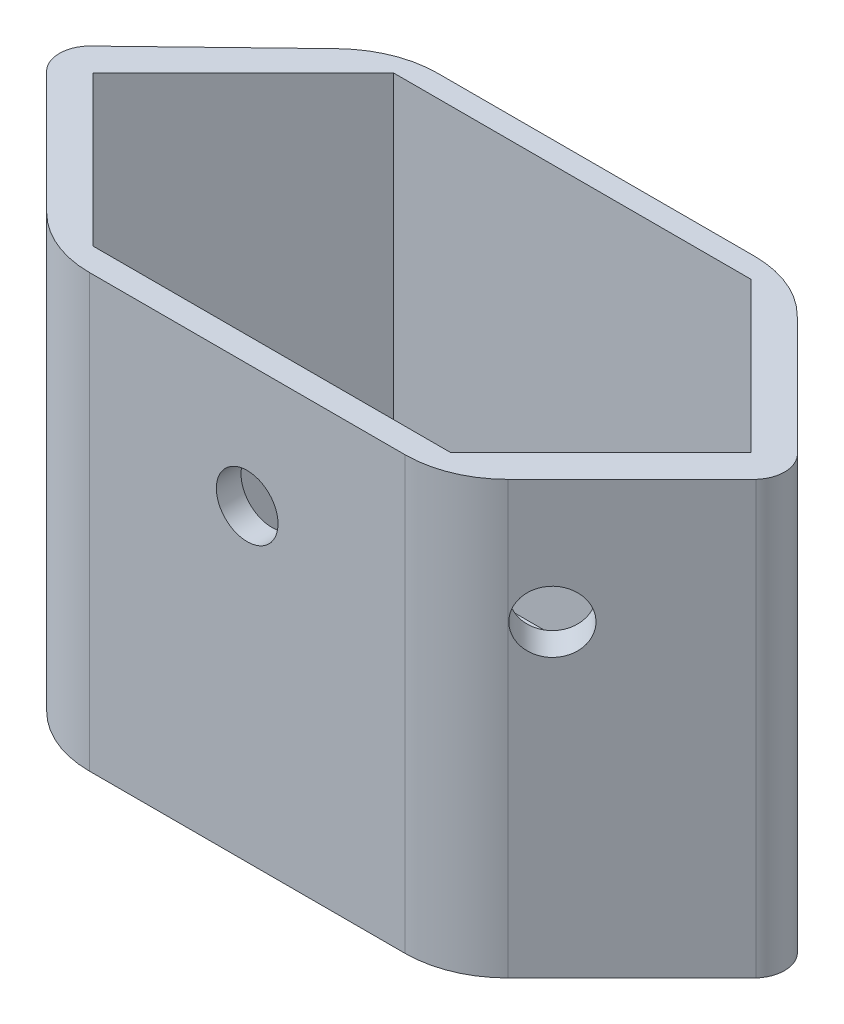
ISO-10303-21;
HEADER;
FILE_DESCRIPTION(('STEP AP214'),'2;1');
FILE_NAME('part.step','',(''),(''),'','','');
FILE_SCHEMA(('AUTOMOTIVE_DESIGN { 1 0 10303 214 1 1 1 1 }'));
ENDSEC;
DATA;
#1=APPLICATION_CONTEXT('core data for automotive mechanical design processes');
#2=APPLICATION_PROTOCOL_DEFINITION('international standard','automotive_design',2000,#1);
#3=PRODUCT_CONTEXT('',#1,'mechanical');
#4=PRODUCT('Part','Part','',(#3));
#5=PRODUCT_RELATED_PRODUCT_CATEGORY('part','',(#4));
#6=PRODUCT_DEFINITION_FORMATION('','',#4);
#7=PRODUCT_DEFINITION_CONTEXT('part definition',#1,'design');
#8=PRODUCT_DEFINITION('design','',#6,#7);
#9=PRODUCT_DEFINITION_SHAPE('','',#8);
#10=(LENGTH_UNIT() NAMED_UNIT(*) SI_UNIT(.MILLI.,.METRE.));
#11=(NAMED_UNIT(*) PLANE_ANGLE_UNIT() SI_UNIT($,.RADIAN.));
#12=(NAMED_UNIT(*) SI_UNIT($,.STERADIAN.) SOLID_ANGLE_UNIT());
#13=UNCERTAINTY_MEASURE_WITH_UNIT(LENGTH_MEASURE(1.E-05),#10,'distance_accuracy_value','');
#14=(GEOMETRIC_REPRESENTATION_CONTEXT(3) GLOBAL_UNCERTAINTY_ASSIGNED_CONTEXT((#13)) GLOBAL_UNIT_ASSIGNED_CONTEXT((#10,
#11,#12)) REPRESENTATION_CONTEXT('',''));
#15=CARTESIAN_POINT('',(0.,0.,0.));
#16=DIRECTION('',(0.,0.,1.));
#17=DIRECTION('',(1.,0.,0.));
#18=AXIS2_PLACEMENT_3D('',#15,#16,#17);
#19=CARTESIAN_POINT('',(7.67893218813452,25.,3.5));
#20=DIRECTION('',(0.,1.,0.));
#21=DIRECTION('',(0.,0.,1.));
#22=AXIS2_PLACEMENT_3D('',#19,#20,#21);
#23=CYLINDRICAL_SURFACE('',#22,5.);
#24=DIRECTION('',(0.,1.,0.));
#25=VECTOR('',#24,1.);
#26=CARTESIAN_POINT('',(7.67893218813453,25.,8.5));
#27=LINE('',#26,#25);
#28=CARTESIAN_POINT('',(7.67893218813453,0.,8.5));
#29=VERTEX_POINT('',#28);
#30=CARTESIAN_POINT('',(7.67893218813453,21.,8.5));
#31=VERTEX_POINT('',#30);
#32=EDGE_CURVE('E284',#29,#31,#27,.T.);
#33=ORIENTED_EDGE('',*,*,#32,.F.);
#34=CARTESIAN_POINT('',(7.67893218813452,0.,3.5));
#35=DIRECTION('',(0.,1.,0.));
#36=DIRECTION('',(0.,0.,1.));
#37=AXIS2_PLACEMENT_3D('',#34,#35,#36);
#38=CIRCLE('',#37,5.);
#39=CARTESIAN_POINT('',(11.2144660940673,0.,7.03553390593273));
#40=VERTEX_POINT('',#39);
#41=EDGE_CURVE('E41',#40,#29,#38,.F.);
#42=ORIENTED_EDGE('',*,*,#41,.F.);
#43=DIRECTION('',(0.,1.,0.));
#44=VECTOR('',#43,1.);
#45=CARTESIAN_POINT('',(11.2144660940673,25.,7.03553390593273));
#46=LINE('',#45,#44);
#47=CARTESIAN_POINT('',(11.2144660940673,21.,7.03553390593273));
#48=VERTEX_POINT('',#47);
#49=EDGE_CURVE('E287',#48,#40,#46,.F.);
#50=ORIENTED_EDGE('',*,*,#49,.F.);
#51=CARTESIAN_POINT('',(7.67893218813452,21.,3.5));
#52=DIRECTION('',(0.,-1.,0.));
#53=DIRECTION('',(0.,0.,-1.));
#54=AXIS2_PLACEMENT_3D('',#51,#52,#53);
#55=CIRCLE('',#54,5.);
#56=EDGE_CURVE('E11',#31,#48,#55,.F.);
#57=ORIENTED_EDGE('',*,*,#56,.F.);
#58=EDGE_LOOP('',(#33,#42,#50,#57));
#59=FACE_BOUND('',#58,.T.);
#60=ADVANCED_FACE('F34',(#59),#23,.T.);
#61=CARTESIAN_POINT('',(-7.67893218813453,25.,3.5));
#62=DIRECTION('',(0.,-1.,0.));
#63=DIRECTION('',(0.,0.,-1.));
#64=AXIS2_PLACEMENT_3D('',#61,#62,#63);
#65=CYLINDRICAL_SURFACE('',#64,5.);
#66=DIRECTION('',(0.,1.,0.));
#67=VECTOR('',#66,1.);
#68=CARTESIAN_POINT('',(-11.2144660940672,25.,7.03553390593276));
#69=LINE('',#68,#67);
#70=CARTESIAN_POINT('',(-11.2144660940672,0.,7.03553390593276));
#71=VERTEX_POINT('',#70);
#72=CARTESIAN_POINT('',(-11.2144660940672,21.,7.03553390593276));
#73=VERTEX_POINT('',#72);
#74=EDGE_CURVE('E274',#71,#73,#69,.T.);
#75=ORIENTED_EDGE('',*,*,#74,.F.);
#76=CARTESIAN_POINT('',(-7.67893218813453,0.,3.5));
#77=DIRECTION('',(0.,1.,0.));
#78=DIRECTION('',(0.,0.,1.));
#79=AXIS2_PLACEMENT_3D('',#76,#77,#78);
#80=CIRCLE('',#79,5.);
#81=CARTESIAN_POINT('',(-7.67893218813453,0.,8.50000000000001));
#82=VERTEX_POINT('',#81);
#83=EDGE_CURVE('E280',#82,#71,#80,.F.);
#84=ORIENTED_EDGE('',*,*,#83,.F.);
#85=DIRECTION('',(0.,1.,0.));
#86=VECTOR('',#85,1.);
#87=CARTESIAN_POINT('',(-7.67893218813453,25.,8.50000000000001));
#88=LINE('',#87,#86);
#89=CARTESIAN_POINT('',(-7.67893218813454,21.,8.5));
#90=VERTEX_POINT('',#89);
#91=EDGE_CURVE('E277',#90,#82,#88,.F.);
#92=ORIENTED_EDGE('',*,*,#91,.F.);
#93=CARTESIAN_POINT('',(-7.67893218813453,21.,3.5));
#94=DIRECTION('',(0.,-1.,0.));
#95=DIRECTION('',(0.,0.,-1.));
#96=AXIS2_PLACEMENT_3D('',#93,#94,#95);
#97=CIRCLE('',#96,5.);
#98=EDGE_CURVE('E282',#73,#90,#97,.F.);
#99=ORIENTED_EDGE('',*,*,#98,.F.);
#100=EDGE_LOOP('',(#75,#84,#92,#99));
#101=FACE_BOUND('',#100,.T.);
#102=ADVANCED_FACE('F299',(#101),#65,.T.);
#103=CARTESIAN_POINT('',(7.81755970103101,25.,-3.35929679636435));
#104=DIRECTION('',(0.,-1.,0.));
#105=DIRECTION('',(0.,0.,-1.));
#106=AXIS2_PLACEMENT_3D('',#103,#104,#105);
#107=CYLINDRICAL_SURFACE('',#106,5.);
#108=DIRECTION('',(0.,-1.,0.));
#109=VECTOR('',#108,1.);
#110=CARTESIAN_POINT('',(7.81755970103101,25.,-8.35929679636435));
#111=LINE('',#110,#109);
#112=CARTESIAN_POINT('',(7.81755970103102,21.,-8.35929679636435));
#113=VERTEX_POINT('',#112);
#114=CARTESIAN_POINT('',(7.81755970103101,0.,-8.35929679636435));
#115=VERTEX_POINT('',#114);
#116=EDGE_CURVE('E264',#113,#115,#111,.T.);
#117=ORIENTED_EDGE('',*,*,#116,.F.);
#118=CARTESIAN_POINT('',(7.81755970103101,21.,-3.35929679636435));
#119=DIRECTION('',(0.,-1.,0.));
#120=DIRECTION('',(0.,0.,-1.));
#121=AXIS2_PLACEMENT_3D('',#118,#119,#120);
#122=CIRCLE('',#121,5.);
#123=CARTESIAN_POINT('',(11.3524712276342,21.,-6.89545297208508));
#124=VERTEX_POINT('',#123);
#125=EDGE_CURVE('E270',#124,#113,#122,.F.);
#126=ORIENTED_EDGE('',*,*,#125,.F.);
#127=DIRECTION('',(0.,-1.,0.));
#128=VECTOR('',#127,1.);
#129=CARTESIAN_POINT('',(11.3524712276342,25.,-6.89545297208508));
#130=LINE('',#129,#128);
#131=CARTESIAN_POINT('',(11.3524712276342,0.,-6.89545297208508));
#132=VERTEX_POINT('',#131);
#133=EDGE_CURVE('E267',#132,#124,#130,.F.);
#134=ORIENTED_EDGE('',*,*,#133,.F.);
#135=CARTESIAN_POINT('',(7.81755970103101,0.,-3.35929679636435));
#136=DIRECTION('',(0.,1.,0.));
#137=DIRECTION('',(0.,0.,1.));
#138=AXIS2_PLACEMENT_3D('',#135,#136,#137);
#139=CIRCLE('',#138,5.);
#140=EDGE_CURVE('E272',#115,#132,#139,.F.);
#141=ORIENTED_EDGE('',*,*,#140,.F.);
#142=EDGE_LOOP('',(#117,#126,#134,#141));
#143=FACE_BOUND('',#142,.T.);
#144=ADVANCED_FACE('F330',(#143),#107,.T.);
#145=CARTESIAN_POINT('',(-7.59505814631381,25.,-3.35929679636435));
#146=DIRECTION('',(0.,1.,0.));
#147=DIRECTION('',(0.,0.,1.));
#148=AXIS2_PLACEMENT_3D('',#145,#146,#147);
#149=CYLINDRICAL_SURFACE('',#148,5.);
#150=DIRECTION('',(0.,1.,0.));
#151=VECTOR('',#150,1.);
#152=CARTESIAN_POINT('',(-7.59505814631381,25.,-8.35929679636435));
#153=LINE('',#152,#151);
#154=CARTESIAN_POINT('',(-7.59505814631381,0.,-8.35929679636435));
#155=VERTEX_POINT('',#154);
#156=CARTESIAN_POINT('',(-7.59505814631381,21.,-8.35929679636435));
#157=VERTEX_POINT('',#156);
#158=EDGE_CURVE('E165',#155,#157,#153,.T.);
#159=ORIENTED_EDGE('',*,*,#158,.F.);
#160=CARTESIAN_POINT('',(-7.59505814631381,0.,-3.35929679636435));
#161=DIRECTION('',(0.,1.,0.));
#162=DIRECTION('',(0.,0.,1.));
#163=AXIS2_PLACEMENT_3D('',#160,#161,#162);
#164=CIRCLE('',#163,5.);
#165=CARTESIAN_POINT('',(-11.0642638646978,0.,-6.95993725099629));
#166=VERTEX_POINT('',#165);
#167=EDGE_CURVE('E260',#166,#155,#164,.F.);
#168=ORIENTED_EDGE('',*,*,#167,.F.);
#169=DIRECTION('',(0.,1.,0.));
#170=VECTOR('',#169,1.);
#171=CARTESIAN_POINT('',(-11.0642638646978,25.,-6.95993725099629));
#172=LINE('',#171,#170);
#173=CARTESIAN_POINT('',(-11.0642638646978,21.,-6.95993725099629));
#174=VERTEX_POINT('',#173);
#175=EDGE_CURVE('E257',#174,#166,#172,.F.);
#176=ORIENTED_EDGE('',*,*,#175,.F.);
#177=CARTESIAN_POINT('',(-7.59505814631381,21.,-3.35929679636435));
#178=DIRECTION('',(0.,-1.,0.));
#179=DIRECTION('',(0.,0.,-1.));
#180=AXIS2_PLACEMENT_3D('',#177,#178,#179);
#181=CIRCLE('',#180,5.);
#182=EDGE_CURVE('E262',#157,#174,#181,.F.);
#183=ORIENTED_EDGE('',*,*,#182,.F.);
#184=EDGE_LOOP('',(#159,#168,#176,#183));
#185=FACE_BOUND('',#184,.T.);
#186=ADVANCED_FACE('F323',(#185),#149,.T.);
#187=CARTESIAN_POINT('',(-16.1317993042843,25.,1.73426092409168E-05));
#188=DIRECTION('',(0.,-1.,0.));
#189=DIRECTION('',(0.,0.,-1.));
#190=AXIS2_PLACEMENT_3D('',#187,#188,#189);
#191=CYLINDRICAL_SURFACE('',#190,1.50016760661851);
#192=CARTESIAN_POINT('',(-16.1317993042843,21.,1.73426092409168E-05));
#193=DIRECTION('',(0.,-1.,0.));
#194=DIRECTION('',(0.,0.,-1.));
#195=AXIS2_PLACEMENT_3D('',#192,#193,#194);
#196=CIRCLE('',#195,1.50016760661851);
#197=CARTESIAN_POINT('',(-17.2503076661575,21.,-0.999703564627948));
#198=VERTEX_POINT('',#197);
#199=CARTESIAN_POINT('',(-17.250692691761,21.,0.999307308239024));
#200=VERTEX_POINT('',#199);
#201=EDGE_CURVE('E313',#198,#200,#196,.F.);
#202=ORIENTED_EDGE('',*,*,#201,.F.);
#203=DIRECTION('',(0.,-1.,0.));
#204=VECTOR('',#203,1.);
#205=CARTESIAN_POINT('',(-17.2503076661575,25.,-0.999703564627948));
#206=LINE('',#205,#204);
#207=CARTESIAN_POINT('',(-17.2503076661575,0.,-0.999703564627948));
#208=VERTEX_POINT('',#207);
#209=EDGE_CURVE('E245',#198,#208,#206,.T.);
#210=ORIENTED_EDGE('',*,*,#209,.T.);
#211=CARTESIAN_POINT('',(-16.1317993042843,0.,1.73426092409168E-05));
#212=DIRECTION('',(0.,1.,0.));
#213=DIRECTION('',(0.,0.,1.));
#214=AXIS2_PLACEMENT_3D('',#211,#212,#213);
#215=CIRCLE('',#214,1.50016760661851);
#216=CARTESIAN_POINT('',(-17.250692691761,0.,0.999307308239033));
#217=VERTEX_POINT('',#216);
#218=EDGE_CURVE('E224',#217,#208,#215,.F.);
#219=ORIENTED_EDGE('',*,*,#218,.F.);
#220=DIRECTION('',(0.,-1.,0.));
#221=VECTOR('',#220,1.);
#222=CARTESIAN_POINT('',(-17.250692691761,25.,0.999307308239033));
#223=LINE('',#222,#221);
#224=EDGE_CURVE('E166',#200,#217,#223,.T.);
#225=ORIENTED_EDGE('',*,*,#224,.F.);
#226=EDGE_LOOP('',(#202,#210,#219,#225));
#227=FACE_BOUND('',#226,.T.);
#228=ADVANCED_FACE('F311',(#227),#191,.T.);
#229=CARTESIAN_POINT('',(-9.12499999999994,25.,9.12500000000005));
#230=DIRECTION('',(-0.707106781186543,0.,0.707106781186552));
#231=DIRECTION('',(0.707106781186552,0.,0.707106781186543));
#232=AXIS2_PLACEMENT_3D('',#229,#230,#231);
#233=PLANE('',#232);
#234=CARTESIAN_POINT('',(-12.437005768509,15.,5.81299423149103));
#235=DIRECTION('',(-0.707106781186543,0.,0.707106781186552));
#236=DIRECTION('',(0.707106781186552,0.,0.707106781186543));
#237=AXIS2_PLACEMENT_3D('',#234,#235,#236);
#238=CIRCLE('',#237,1.5);
#239=CARTESIAN_POINT('',(-11.3763455967292,15.,6.87365440327084));
#240=VERTEX_POINT('',#239);
#241=EDGE_CURVE('E393',#240,#240,#238,.T.);
#242=ORIENTED_EDGE('',*,*,#241,.F.);
#243=EDGE_LOOP('',(#242));
#244=FACE_BOUND('',#243,.T.);
#245=DIRECTION('',(-0.707106781186552,0.,-0.707106781186543));
#246=VECTOR('',#245,1.);
#247=CARTESIAN_POINT('',(-9.12499999999994,0.,9.12500000000005));
#248=LINE('',#247,#246);
#249=EDGE_CURVE('E227',#71,#217,#248,.T.);
#250=ORIENTED_EDGE('',*,*,#249,.F.);
#251=ORIENTED_EDGE('',*,*,#74,.T.);
#252=DIRECTION('',(0.707106781186552,0.,0.707106781186543));
#253=VECTOR('',#252,1.);
#254=CARTESIAN_POINT('',(-9.12499999999994,21.,9.12500000000005));
#255=LINE('',#254,#253);
#256=EDGE_CURVE('E308',#200,#73,#255,.T.);
#257=ORIENTED_EDGE('',*,*,#256,.F.);
#258=ORIENTED_EDGE('',*,*,#224,.T.);
#259=EDGE_LOOP('',(#250,#251,#257,#258));
#260=FACE_BOUND('',#259,.T.);
#261=ADVANCED_FACE('F306',(#244,#260),#233,.T.);
#262=CARTESIAN_POINT('',(0.,25.,8.5));
#263=DIRECTION('',(0.,0.,-1.));
#264=DIRECTION('',(-1.,0.,0.));
#265=AXIS2_PLACEMENT_3D('',#262,#263,#264);
#266=PLANE('',#265);
#267=CARTESIAN_POINT('',(0.,15.,8.5));
#268=DIRECTION('',(0.,0.,-1.));
#269=DIRECTION('',(-1.,0.,0.));
#270=AXIS2_PLACEMENT_3D('',#267,#268,#269);
#271=CIRCLE('',#270,1.5);
#272=CARTESIAN_POINT('',(-1.50000000000007,15.,8.5));
#273=VERTEX_POINT('',#272);
#274=EDGE_CURVE('E387',#273,#273,#271,.T.);
#275=ORIENTED_EDGE('',*,*,#274,.T.);
#276=EDGE_LOOP('',(#275));
#277=FACE_BOUND('',#276,.T.);
#278=DIRECTION('',(1.,0.,0.));
#279=VECTOR('',#278,1.);
#280=CARTESIAN_POINT('',(0.,0.,8.5));
#281=LINE('',#280,#279);
#282=EDGE_CURVE('E229',#82,#29,#281,.T.);
#283=ORIENTED_EDGE('',*,*,#282,.T.);
#284=ORIENTED_EDGE('',*,*,#32,.T.);
#285=DIRECTION('',(1.,0.,0.));
#286=VECTOR('',#285,1.);
#287=CARTESIAN_POINT('',(-41.5470865906406,21.,8.5));
#288=LINE('',#287,#286);
#289=EDGE_CURVE('E296',#90,#31,#288,.T.);
#290=ORIENTED_EDGE('',*,*,#289,.F.);
#291=ORIENTED_EDGE('',*,*,#91,.T.);
#292=EDGE_LOOP('',(#283,#284,#290,#291));
#293=FACE_BOUND('',#292,.T.);
#294=ADVANCED_FACE('F294',(#277,#293),#266,.F.);
#295=CARTESIAN_POINT('',(9.12500000000002,25.,9.12499999999999));
#296=DIRECTION('',(-0.707106781186549,0.,-0.707106781186546));
#297=DIRECTION('',(-0.707106781186546,0.,0.707106781186549));
#298=AXIS2_PLACEMENT_3D('',#295,#296,#297);
#299=PLANE('',#298);
#300=CARTESIAN_POINT('',(12.2955844122716,15.,5.95441558772842));
#301=DIRECTION('',(-0.707106781186549,0.,-0.707106781186546));
#302=DIRECTION('',(-0.707106781186546,0.,0.707106781186549));
#303=AXIS2_PLACEMENT_3D('',#300,#301,#302);
#304=CIRCLE('',#303,1.5);
#305=CARTESIAN_POINT('',(11.2349242404918,15.,7.01507575950825));
#306=VERTEX_POINT('',#305);
#307=EDGE_CURVE('E378',#306,#306,#304,.T.);
#308=ORIENTED_EDGE('',*,*,#307,.T.);
#309=EDGE_LOOP('',(#308));
#310=FACE_BOUND('',#309,.T.);
#311=DIRECTION('',(-0.707106781186546,0.,0.707106781186549));
#312=VECTOR('',#311,1.);
#313=CARTESIAN_POINT('',(9.12500000000002,21.,9.12499999999999));
#314=LINE('',#313,#312);
#315=CARTESIAN_POINT('',(17.2499999999999,21.,1.00000000000005));
#316=VERTEX_POINT('',#315);
#317=EDGE_CURVE('E348',#316,#48,#314,.T.);
#318=ORIENTED_EDGE('',*,*,#317,.T.);
#319=ORIENTED_EDGE('',*,*,#49,.T.);
#320=DIRECTION('',(0.707106781186546,0.,-0.707106781186549));
#321=VECTOR('',#320,1.);
#322=CARTESIAN_POINT('',(9.12500000000002,0.,9.12499999999999));
#323=LINE('',#322,#321);
#324=CARTESIAN_POINT('',(17.2499999999999,0.,1.00000000000006));
#325=VERTEX_POINT('',#324);
#326=EDGE_CURVE('E232',#40,#325,#323,.T.);
#327=ORIENTED_EDGE('',*,*,#326,.T.);
#328=DIRECTION('',(0.,-1.,0.));
#329=VECTOR('',#328,1.);
#330=CARTESIAN_POINT('',(17.2499999999999,25.,1.00000000000006));
#331=LINE('',#330,#329);
#332=EDGE_CURVE('E250',#316,#325,#331,.T.);
#333=ORIENTED_EDGE('',*,*,#332,.F.);
#334=EDGE_LOOP('',(#318,#319,#327,#333));
#335=FACE_BOUND('',#334,.T.);
#336=ADVANCED_FACE('F347',(#310,#335),#299,.F.);
#337=CARTESIAN_POINT('',(16.1319660112501,25.,0.));
#338=DIRECTION('',(0.,-1.,0.));
#339=DIRECTION('',(0.,0.,-1.));
#340=AXIS2_PLACEMENT_3D('',#337,#338,#339);
#341=CYLINDRICAL_SURFACE('',#340,1.5);
#342=CARTESIAN_POINT('',(16.1319660112501,21.,0.));
#343=DIRECTION('',(0.,-1.,0.));
#344=DIRECTION('',(0.,0.,-1.));
#345=AXIS2_PLACEMENT_3D('',#342,#343,#344);
#346=CIRCLE('',#345,1.5);
#347=CARTESIAN_POINT('',(17.25,21.,-1.00000000000001));
#348=VERTEX_POINT('',#347);
#349=EDGE_CURVE('E344',#316,#348,#346,.F.);
#350=ORIENTED_EDGE('',*,*,#349,.F.);
#351=ORIENTED_EDGE('',*,*,#332,.T.);
#352=CARTESIAN_POINT('',(16.1319660112501,0.,0.));
#353=DIRECTION('',(0.,1.,0.));
#354=DIRECTION('',(0.,0.,1.));
#355=AXIS2_PLACEMENT_3D('',#352,#353,#354);
#356=CIRCLE('',#355,1.5);
#357=CARTESIAN_POINT('',(17.25,0.,-1.00000000000002));
#358=VERTEX_POINT('',#357);
#359=EDGE_CURVE('E234',#358,#325,#356,.F.);
#360=ORIENTED_EDGE('',*,*,#359,.F.);
#361=DIRECTION('',(0.,-1.,0.));
#362=VECTOR('',#361,1.);
#363=CARTESIAN_POINT('',(17.25,25.,-1.00000000000002));
#364=LINE('',#363,#362);
#365=EDGE_CURVE('E247',#348,#358,#364,.T.);
#366=ORIENTED_EDGE('',*,*,#365,.F.);
#367=EDGE_LOOP('',(#350,#351,#360,#366));
#368=FACE_BOUND('',#367,.T.);
#369=ADVANCED_FACE('F342',(#368),#341,.T.);
#370=CARTESIAN_POINT('',(9.12196362464636,25.,-9.12517548550626));
#371=DIRECTION('',(0.70698230532064,0.,-0.707231235144145));
#372=DIRECTION('',(-0.707231235144145,0.,-0.70698230532064));
#373=AXIS2_PLACEMENT_3D('',#370,#371,#372);
#374=PLANE('',#373);
#375=DIRECTION('',(0.707231235144145,0.,0.70698230532064));
#376=VECTOR('',#375,1.);
#377=CARTESIAN_POINT('',(9.12196362464636,0.,-9.12517548550626));
#378=LINE('',#377,#376);
#379=EDGE_CURVE('E237',#132,#358,#378,.T.);
#380=ORIENTED_EDGE('',*,*,#379,.F.);
#381=ORIENTED_EDGE('',*,*,#133,.T.);
#382=DIRECTION('',(-0.707231235144145,0.,-0.70698230532064));
#383=VECTOR('',#382,1.);
#384=CARTESIAN_POINT('',(9.12196362464636,21.,-9.12517548550626));
#385=LINE('',#384,#383);
#386=EDGE_CURVE('E339',#348,#124,#385,.T.);
#387=ORIENTED_EDGE('',*,*,#386,.F.);
#388=ORIENTED_EDGE('',*,*,#365,.T.);
#389=EDGE_LOOP('',(#380,#381,#387,#388));
#390=FACE_BOUND('',#389,.T.);
#391=ADVANCED_FACE('F337',(#390),#374,.T.);
#392=CARTESIAN_POINT('',(0.,25.,-8.35929679636435));
#393=DIRECTION('',(0.,0.,-1.));
#394=DIRECTION('',(-1.,0.,0.));
#395=AXIS2_PLACEMENT_3D('',#392,#393,#394);
#396=PLANE('',#395);
#397=DIRECTION('',(-1.,0.,0.));
#398=VECTOR('',#397,1.);
#399=CARTESIAN_POINT('',(0.,21.,-8.35929679636435));
#400=LINE('',#399,#398);
#401=EDGE_CURVE('E328',#113,#157,#400,.T.);
#402=ORIENTED_EDGE('',*,*,#401,.F.);
#403=ORIENTED_EDGE('',*,*,#116,.T.);
#404=DIRECTION('',(1.,0.,0.));
#405=VECTOR('',#404,1.);
#406=CARTESIAN_POINT('',(0.,0.,-8.35929679636435));
#407=LINE('',#406,#405);
#408=EDGE_CURVE('E239',#155,#115,#407,.T.);
#409=ORIENTED_EDGE('',*,*,#408,.F.);
#410=ORIENTED_EDGE('',*,*,#158,.T.);
#411=EDGE_LOOP('',(#402,#403,#409,#410));
#412=FACE_BOUND('',#411,.T.);
#413=ADVANCED_FACE('F326',(#412),#396,.T.);
#414=CARTESIAN_POINT('',(-8.80407243656507,25.,-9.13762456132839));
#415=DIRECTION('',(-0.693841143676791,0.,-0.720128090926387));
#416=DIRECTION('',(-0.720128090926387,0.,0.693841143676791));
#417=AXIS2_PLACEMENT_3D('',#414,#415,#416);
#418=PLANE('',#417);
#419=DIRECTION('',(-0.720128090926387,0.,0.693841143676791));
#420=VECTOR('',#419,1.);
#421=CARTESIAN_POINT('',(-8.80407243656507,21.,-9.13762456132839));
#422=LINE('',#421,#420);
#423=EDGE_CURVE('E317',#174,#198,#422,.T.);
#424=ORIENTED_EDGE('',*,*,#423,.F.);
#425=ORIENTED_EDGE('',*,*,#175,.T.);
#426=DIRECTION('',(0.720128090926387,0.,-0.693841143676791));
#427=VECTOR('',#426,1.);
#428=CARTESIAN_POINT('',(-8.80407243656507,0.,-9.13762456132839));
#429=LINE('',#428,#427);
#430=EDGE_CURVE('E242',#208,#166,#429,.T.);
#431=ORIENTED_EDGE('',*,*,#430,.F.);
#432=ORIENTED_EDGE('',*,*,#209,.F.);
#433=EDGE_LOOP('',(#424,#425,#431,#432));
#434=FACE_BOUND('',#433,.T.);
#435=ADVANCED_FACE('F316',(#434),#418,.T.);
#436=CARTESIAN_POINT('',(0.,0.,0.));
#437=DIRECTION('',(0.,1.,0.));
#438=DIRECTION('',(0.,0.,1.));
#439=AXIS2_PLACEMENT_3D('',#436,#437,#438);
#440=PLANE('',#439);
#441=CARTESIAN_POINT('',(-9.74999999999999,0.,-0.499999999999994));
#442=DIRECTION('',(0.,1.,0.));
#443=DIRECTION('',(0.,0.,1.));
#444=AXIS2_PLACEMENT_3D('',#441,#442,#443);
#445=CIRCLE('',#444,1.95);
#446=CARTESIAN_POINT('',(-9.74999999999999,0.,1.45000000000001));
#447=VERTEX_POINT('',#446);
#448=EDGE_CURVE('E211',#447,#447,#445,.T.);
#449=ORIENTED_EDGE('',*,*,#448,.T.);
#450=EDGE_LOOP('',(#449));
#451=FACE_BOUND('',#450,.T.);
#452=CARTESIAN_POINT('',(9.75,0.,-0.499999999999997));
#453=DIRECTION('',(0.,1.,0.));
#454=DIRECTION('',(0.,0.,1.));
#455=AXIS2_PLACEMENT_3D('',#452,#453,#454);
#456=CIRCLE('',#455,1.95);
#457=CARTESIAN_POINT('',(9.75,0.,1.45));
#458=VERTEX_POINT('',#457);
#459=EDGE_CURVE('E206',#458,#458,#456,.T.);
#460=ORIENTED_EDGE('',*,*,#459,.T.);
#461=EDGE_LOOP('',(#460));
#462=FACE_BOUND('',#461,.T.);
#463=CARTESIAN_POINT('',(0.,0.,-3.5));
#464=DIRECTION('',(0.,1.,0.));
#465=DIRECTION('',(0.,0.,1.));
#466=AXIS2_PLACEMENT_3D('',#463,#464,#465);
#467=CIRCLE('',#466,1.95);
#468=CARTESIAN_POINT('',(0.,0.,-1.55));
#469=VERTEX_POINT('',#468);
#470=EDGE_CURVE('E217',#469,#469,#467,.T.);
#471=ORIENTED_EDGE('',*,*,#470,.T.);
#472=EDGE_LOOP('',(#471));
#473=FACE_BOUND('',#472,.T.);
#474=ORIENTED_EDGE('',*,*,#326,.F.);
#475=ORIENTED_EDGE('',*,*,#41,.T.);
#476=ORIENTED_EDGE('',*,*,#282,.F.);
#477=ORIENTED_EDGE('',*,*,#83,.T.);
#478=ORIENTED_EDGE('',*,*,#249,.T.);
#479=ORIENTED_EDGE('',*,*,#218,.T.);
#480=ORIENTED_EDGE('',*,*,#430,.T.);
#481=ORIENTED_EDGE('',*,*,#167,.T.);
#482=ORIENTED_EDGE('',*,*,#408,.T.);
#483=ORIENTED_EDGE('',*,*,#140,.T.);
#484=ORIENTED_EDGE('',*,*,#379,.T.);
#485=ORIENTED_EDGE('',*,*,#359,.T.);
#486=EDGE_LOOP('',(#474,#475,#476,#477,#478,#479,#480,#481,#482,#483,#484,#485));
#487=FACE_BOUND('',#486,.T.);
#488=ADVANCED_FACE('F291',(#451,#462,#473,#487),#440,.F.);
#489=CARTESIAN_POINT('',(0.,1.2,-7.3));
#490=DIRECTION('',(0.,0.,1.));
#491=DIRECTION('',(1.,0.,0.));
#492=AXIS2_PLACEMENT_3D('',#489,#490,#491);
#493=PLANE('',#492);
#494=DIRECTION('',(1.,0.,0.));
#495=VECTOR('',#494,1.);
#496=CARTESIAN_POINT('',(0.,21.,-7.3));
#497=LINE('',#496,#495);
#498=CARTESIAN_POINT('',(-8.69142135623738,21.,-7.3));
#499=VERTEX_POINT('',#498);
#500=CARTESIAN_POINT('',(8.6914213562373,21.,-7.3));
#501=VERTEX_POINT('',#500);
#502=EDGE_CURVE('E175',#499,#501,#497,.T.);
#503=ORIENTED_EDGE('',*,*,#502,.F.);
#504=DIRECTION('',(0.,1.,0.));
#505=VECTOR('',#504,1.);
#506=CARTESIAN_POINT('',(-8.69142135623738,1.2,-7.3));
#507=LINE('',#506,#505);
#508=CARTESIAN_POINT('',(-8.69142135623738,1.2,-7.3));
#509=VERTEX_POINT('',#508);
#510=EDGE_CURVE('E196',#509,#499,#507,.T.);
#511=ORIENTED_EDGE('',*,*,#510,.F.);
#512=DIRECTION('',(1.,0.,0.));
#513=VECTOR('',#512,1.);
#514=CARTESIAN_POINT('',(0.,1.2,-7.3));
#515=LINE('',#514,#513);
#516=CARTESIAN_POINT('',(8.6914213562373,1.2,-7.3));
#517=VERTEX_POINT('',#516);
#518=EDGE_CURVE('E222',#509,#517,#515,.T.);
#519=ORIENTED_EDGE('',*,*,#518,.T.);
#520=DIRECTION('',(0.,1.,0.));
#521=VECTOR('',#520,1.);
#522=CARTESIAN_POINT('',(8.6914213562373,1.2,-7.3));
#523=LINE('',#522,#521);
#524=EDGE_CURVE('E184',#517,#501,#523,.T.);
#525=ORIENTED_EDGE('',*,*,#524,.T.);
#526=EDGE_LOOP('',(#503,#511,#519,#525));
#527=FACE_BOUND('',#526,.T.);
#528=ADVANCED_FACE('F359',(#527),#493,.T.);
#529=CARTESIAN_POINT('',(0.,1.2,7.3));
#530=DIRECTION('',(0.,0.,1.));
#531=DIRECTION('',(1.,0.,0.));
#532=AXIS2_PLACEMENT_3D('',#529,#530,#531);
#533=PLANE('',#532);
#534=CARTESIAN_POINT('',(0.,15.,7.3));
#535=DIRECTION('',(0.,0.,-1.));
#536=DIRECTION('',(-1.,0.,0.));
#537=AXIS2_PLACEMENT_3D('',#534,#535,#536);
#538=CIRCLE('',#537,1.5);
#539=CARTESIAN_POINT('',(-1.50000000000007,15.,7.3));
#540=VERTEX_POINT('',#539);
#541=EDGE_CURVE('E390',#540,#540,#538,.T.);
#542=ORIENTED_EDGE('',*,*,#541,.F.);
#543=EDGE_LOOP('',(#542));
#544=FACE_BOUND('',#543,.T.);
#545=DIRECTION('',(0.,1.,0.));
#546=VECTOR('',#545,1.);
#547=CARTESIAN_POINT('',(-8.69142135623745,1.2,7.29999999999993));
#548=LINE('',#547,#546);
#549=CARTESIAN_POINT('',(-8.69142135623745,1.2,7.29999999999993));
#550=VERTEX_POINT('',#549);
#551=CARTESIAN_POINT('',(-8.69142135623745,21.,7.3));
#552=VERTEX_POINT('',#551);
#553=EDGE_CURVE('E174',#550,#552,#548,.T.);
#554=ORIENTED_EDGE('',*,*,#553,.T.);
#555=DIRECTION('',(1.,0.,0.));
#556=VECTOR('',#555,1.);
#557=CARTESIAN_POINT('',(0.,21.,7.3));
#558=LINE('',#557,#556);
#559=CARTESIAN_POINT('',(8.69142135623732,21.,7.3));
#560=VERTEX_POINT('',#559);
#561=EDGE_CURVE('E157',#552,#560,#558,.T.);
#562=ORIENTED_EDGE('',*,*,#561,.T.);
#563=DIRECTION('',(0.,1.,0.));
#564=VECTOR('',#563,1.);
#565=CARTESIAN_POINT('',(8.69142135623732,1.2,7.3));
#566=LINE('',#565,#564);
#567=CARTESIAN_POINT('',(8.69142135623732,1.2,7.3));
#568=VERTEX_POINT('',#567);
#569=EDGE_CURVE('E172',#568,#560,#566,.T.);
#570=ORIENTED_EDGE('',*,*,#569,.F.);
#571=DIRECTION('',(1.,0.,0.));
#572=VECTOR('',#571,1.);
#573=CARTESIAN_POINT('',(0.,1.2,7.3));
#574=LINE('',#573,#572);
#575=EDGE_CURVE('E220',#550,#568,#574,.T.);
#576=ORIENTED_EDGE('',*,*,#575,.F.);
#577=EDGE_LOOP('',(#554,#562,#570,#576));
#578=FACE_BOUND('',#577,.T.);
#579=ADVANCED_FACE('F171',(#544,#578),#533,.F.);
#580=CARTESIAN_POINT('',(0.,1.2,0.));
#581=DIRECTION('',(0.,1.,0.));
#582=DIRECTION('',(0.,0.,1.));
#583=AXIS2_PLACEMENT_3D('',#580,#581,#582);
#584=PLANE('',#583);
#585=ORIENTED_EDGE('',*,*,#518,.F.);
#586=DIRECTION('',(-0.707106781186547,0.,0.707106781186548));
#587=VECTOR('',#586,1.);
#588=CARTESIAN_POINT('',(-7.9957106781187,1.2,-7.99571067811869));
#589=LINE('',#588,#587);
#590=CARTESIAN_POINT('',(-15.9914213562374,1.2,0.));
#591=VERTEX_POINT('',#590);
#592=EDGE_CURVE('E189',#509,#591,#589,.T.);
#593=ORIENTED_EDGE('',*,*,#592,.T.);
#594=DIRECTION('',(0.707106781186548,0.,0.707106781186547));
#595=VECTOR('',#594,1.);
#596=CARTESIAN_POINT('',(-7.99571067811869,1.2,7.99571067811869));
#597=LINE('',#596,#595);
#598=EDGE_CURVE('E192',#591,#550,#597,.T.);
#599=ORIENTED_EDGE('',*,*,#598,.T.);
#600=ORIENTED_EDGE('',*,*,#575,.T.);
#601=DIRECTION('',(-0.707106781186547,0.,0.707106781186548));
#602=VECTOR('',#601,1.);
#603=CARTESIAN_POINT('',(7.99571067811866,1.2,7.99571067811866));
#604=LINE('',#603,#602);
#605=CARTESIAN_POINT('',(15.9914213562373,1.2,0.));
#606=VERTEX_POINT('',#605);
#607=EDGE_CURVE('E180',#606,#568,#604,.T.);
#608=ORIENTED_EDGE('',*,*,#607,.F.);
#609=DIRECTION('',(0.707106781186548,0.,0.707106781186547));
#610=VECTOR('',#609,1.);
#611=CARTESIAN_POINT('',(7.99571067811865,1.2,-7.99571067811865));
#612=LINE('',#611,#610);
#613=EDGE_CURVE('E182',#517,#606,#612,.T.);
#614=ORIENTED_EDGE('',*,*,#613,.F.);
#615=EDGE_LOOP('',(#585,#593,#599,#600,#608,#614));
#616=FACE_BOUND('',#615,.T.);
#617=CARTESIAN_POINT('',(-9.74999999999999,1.2,-0.499999999999994));
#618=DIRECTION('',(0.,1.,0.));
#619=DIRECTION('',(0.,0.,1.));
#620=AXIS2_PLACEMENT_3D('',#617,#618,#619);
#621=CIRCLE('',#620,1.95);
#622=CARTESIAN_POINT('',(-9.74999999999999,1.2,1.45000000000001));
#623=VERTEX_POINT('',#622);
#624=EDGE_CURVE('E203',#623,#623,#621,.T.);
#625=ORIENTED_EDGE('',*,*,#624,.F.);
#626=EDGE_LOOP('',(#625));
#627=FACE_BOUND('',#626,.T.);
#628=CARTESIAN_POINT('',(9.75,1.2,-0.499999999999997));
#629=DIRECTION('',(0.,1.,0.));
#630=DIRECTION('',(0.,0.,1.));
#631=AXIS2_PLACEMENT_3D('',#628,#629,#630);
#632=CIRCLE('',#631,1.95);
#633=CARTESIAN_POINT('',(9.75,1.2,1.45));
#634=VERTEX_POINT('',#633);
#635=EDGE_CURVE('E199',#634,#634,#632,.T.);
#636=ORIENTED_EDGE('',*,*,#635,.F.);
#637=EDGE_LOOP('',(#636));
#638=FACE_BOUND('',#637,.T.);
#639=CARTESIAN_POINT('',(0.,1.2,-3.5));
#640=DIRECTION('',(0.,1.,0.));
#641=DIRECTION('',(0.,0.,1.));
#642=AXIS2_PLACEMENT_3D('',#639,#640,#641);
#643=CIRCLE('',#642,1.95);
#644=CARTESIAN_POINT('',(0.,1.2,-1.55));
#645=VERTEX_POINT('',#644);
#646=EDGE_CURVE('E214',#645,#645,#643,.T.);
#647=ORIENTED_EDGE('',*,*,#646,.F.);
#648=EDGE_LOOP('',(#647));
#649=FACE_BOUND('',#648,.T.);
#650=ADVANCED_FACE('F365',(#616,#627,#638,#649),#584,.T.);
#651=CARTESIAN_POINT('',(0.,-22.6,-3.5));
#652=DIRECTION('',(0.,1.,0.));
#653=DIRECTION('',(0.,0.,1.));
#654=AXIS2_PLACEMENT_3D('',#651,#652,#653);
#655=CYLINDRICAL_SURFACE('',#654,1.95);
#656=ORIENTED_EDGE('',*,*,#646,.T.);
#657=EDGE_LOOP('',(#656));
#658=FACE_BOUND('',#657,.T.);
#659=ORIENTED_EDGE('',*,*,#470,.F.);
#660=EDGE_LOOP('',(#659));
#661=FACE_BOUND('',#660,.T.);
#662=ADVANCED_FACE('F454',(#658,#661),#655,.F.);
#663=CARTESIAN_POINT('',(9.75,-22.6,-0.499999999999997));
#664=DIRECTION('',(0.,1.,0.));
#665=DIRECTION('',(0.,0.,1.));
#666=AXIS2_PLACEMENT_3D('',#663,#664,#665);
#667=CYLINDRICAL_SURFACE('',#666,1.95);
#668=ORIENTED_EDGE('',*,*,#635,.T.);
#669=EDGE_LOOP('',(#668));
#670=FACE_BOUND('',#669,.T.);
#671=ORIENTED_EDGE('',*,*,#459,.F.);
#672=EDGE_LOOP('',(#671));
#673=FACE_BOUND('',#672,.T.);
#674=ADVANCED_FACE('F457',(#670,#673),#667,.F.);
#675=CARTESIAN_POINT('',(-9.74999999999999,-22.6,-0.499999999999994));
#676=DIRECTION('',(0.,1.,0.));
#677=DIRECTION('',(0.,0.,1.));
#678=AXIS2_PLACEMENT_3D('',#675,#676,#677);
#679=CYLINDRICAL_SURFACE('',#678,1.95);
#680=ORIENTED_EDGE('',*,*,#624,.T.);
#681=EDGE_LOOP('',(#680));
#682=FACE_BOUND('',#681,.T.);
#683=ORIENTED_EDGE('',*,*,#448,.F.);
#684=EDGE_LOOP('',(#683));
#685=FACE_BOUND('',#684,.T.);
#686=ADVANCED_FACE('F410',(#682,#685),#679,.F.);
#687=CARTESIAN_POINT('',(-7.9957106781187,1.2,-7.99571067811869));
#688=DIRECTION('',(-0.707106781186548,0.,-0.707106781186547));
#689=DIRECTION('',(-0.707106781186547,0.,0.707106781186548));
#690=AXIS2_PLACEMENT_3D('',#687,#688,#689);
#691=PLANE('',#690);
#692=ORIENTED_EDGE('',*,*,#510,.T.);
#693=DIRECTION('',(-0.707106781186547,0.,0.707106781186548));
#694=VECTOR('',#693,1.);
#695=CARTESIAN_POINT('',(-7.9957106781187,21.,-7.99571067811869));
#696=LINE('',#695,#694);
#697=CARTESIAN_POINT('',(-15.9914213562374,21.,0.));
#698=VERTEX_POINT('',#697);
#699=EDGE_CURVE('E372',#499,#698,#696,.T.);
#700=ORIENTED_EDGE('',*,*,#699,.T.);
#701=DIRECTION('',(0.,1.,0.));
#702=VECTOR('',#701,1.);
#703=CARTESIAN_POINT('',(-15.9914213562374,1.2,0.));
#704=LINE('',#703,#702);
#705=EDGE_CURVE('E195',#591,#698,#704,.T.);
#706=ORIENTED_EDGE('',*,*,#705,.F.);
#707=ORIENTED_EDGE('',*,*,#592,.F.);
#708=EDGE_LOOP('',(#692,#700,#706,#707));
#709=FACE_BOUND('',#708,.T.);
#710=ADVANCED_FACE('F403',(#709),#691,.F.);
#711=CARTESIAN_POINT('',(-7.99571067811869,1.2,7.99571067811869));
#712=DIRECTION('',(-0.707106781186547,0.,0.707106781186548));
#713=DIRECTION('',(0.707106781186548,0.,0.707106781186547));
#714=AXIS2_PLACEMENT_3D('',#711,#712,#713);
#715=PLANE('',#714);
#716=CARTESIAN_POINT('',(-11.3077164466277,15.,4.6837049096097));
#717=DIRECTION('',(0.707106781186547,0.,-0.707106781186548));
#718=DIRECTION('',(-0.707106781186548,0.,-0.707106781186547));
#719=AXIS2_PLACEMENT_3D('',#716,#717,#718);
#720=CIRCLE('',#719,1.5);
#721=CARTESIAN_POINT('',(-12.3683766184075,15.,3.62304473782988));
#722=VERTEX_POINT('',#721);
#723=EDGE_CURVE('E396',#722,#722,#720,.T.);
#724=ORIENTED_EDGE('',*,*,#723,.F.);
#725=EDGE_LOOP('',(#724));
#726=FACE_BOUND('',#725,.T.);
#727=ORIENTED_EDGE('',*,*,#705,.T.);
#728=DIRECTION('',(0.707106781186548,0.,0.707106781186547));
#729=VECTOR('',#728,1.);
#730=CARTESIAN_POINT('',(-7.99571067811869,21.,7.99571067811869));
#731=LINE('',#730,#729);
#732=EDGE_CURVE('E370',#698,#552,#731,.T.);
#733=ORIENTED_EDGE('',*,*,#732,.T.);
#734=ORIENTED_EDGE('',*,*,#553,.F.);
#735=ORIENTED_EDGE('',*,*,#598,.F.);
#736=EDGE_LOOP('',(#727,#733,#734,#735));
#737=FACE_BOUND('',#736,.T.);
#738=ADVANCED_FACE('F369',(#726,#737),#715,.F.);
#739=CARTESIAN_POINT('',(7.99571067811865,1.2,-7.99571067811865));
#740=DIRECTION('',(-0.707106781186547,0.,0.707106781186548));
#741=DIRECTION('',(0.707106781186548,0.,0.707106781186547));
#742=AXIS2_PLACEMENT_3D('',#739,#740,#741);
#743=PLANE('',#742);
#744=DIRECTION('',(0.707106781186548,0.,0.707106781186547));
#745=VECTOR('',#744,1.);
#746=CARTESIAN_POINT('',(7.99571067811865,21.,-7.99571067811865));
#747=LINE('',#746,#745);
#748=CARTESIAN_POINT('',(15.9914213562373,21.,0.));
#749=VERTEX_POINT('',#748);
#750=EDGE_CURVE('E160',#501,#749,#747,.T.);
#751=ORIENTED_EDGE('',*,*,#750,.F.);
#752=ORIENTED_EDGE('',*,*,#524,.F.);
#753=ORIENTED_EDGE('',*,*,#613,.T.);
#754=DIRECTION('',(0.,1.,0.));
#755=VECTOR('',#754,1.);
#756=CARTESIAN_POINT('',(15.9914213562373,1.2,0.));
#757=LINE('',#756,#755);
#758=EDGE_CURVE('E181',#606,#749,#757,.T.);
#759=ORIENTED_EDGE('',*,*,#758,.T.);
#760=EDGE_LOOP('',(#751,#752,#753,#759));
#761=FACE_BOUND('',#760,.T.);
#762=ADVANCED_FACE('F363',(#761),#743,.T.);
#763=CARTESIAN_POINT('',(7.99571067811866,1.2,7.99571067811866));
#764=DIRECTION('',(-0.707106781186548,0.,-0.707106781186547));
#765=DIRECTION('',(-0.707106781186547,0.,0.707106781186548));
#766=AXIS2_PLACEMENT_3D('',#763,#764,#765);
#767=PLANE('',#766);
#768=CARTESIAN_POINT('',(11.1662950903902,15.,4.82512626584709));
#769=DIRECTION('',(-0.707106781186548,0.,-0.707106781186548));
#770=DIRECTION('',(-0.707106781186548,0.,0.707106781186548));
#771=AXIS2_PLACEMENT_3D('',#768,#769,#770);
#772=CIRCLE('',#771,1.5);
#773=CARTESIAN_POINT('',(10.1056349186104,15.,5.88578643762691));
#774=VERTEX_POINT('',#773);
#775=EDGE_CURVE('E382',#774,#774,#772,.T.);
#776=ORIENTED_EDGE('',*,*,#775,.F.);
#777=EDGE_LOOP('',(#776));
#778=FACE_BOUND('',#777,.T.);
#779=DIRECTION('',(-0.707106781186547,0.,0.707106781186548));
#780=VECTOR('',#779,1.);
#781=CARTESIAN_POINT('',(7.99571067811866,21.,7.99571067811866));
#782=LINE('',#781,#780);
#783=EDGE_CURVE('E154',#749,#560,#782,.T.);
#784=ORIENTED_EDGE('',*,*,#783,.F.);
#785=ORIENTED_EDGE('',*,*,#758,.F.);
#786=ORIENTED_EDGE('',*,*,#607,.T.);
#787=ORIENTED_EDGE('',*,*,#569,.T.);
#788=EDGE_LOOP('',(#784,#785,#786,#787));
#789=FACE_BOUND('',#788,.T.);
#790=ADVANCED_FACE('F178',(#778,#789),#767,.T.);
#791=CARTESIAN_POINT('',(-41.5470865906406,21.,-21.5));
#792=DIRECTION('',(0.,-1.,0.));
#793=DIRECTION('',(0.,0.,-1.));
#794=AXIS2_PLACEMENT_3D('',#791,#792,#793);
#795=PLANE('',#794);
#796=ORIENTED_EDGE('',*,*,#289,.T.);
#797=ORIENTED_EDGE('',*,*,#56,.T.);
#798=ORIENTED_EDGE('',*,*,#317,.F.);
#799=ORIENTED_EDGE('',*,*,#349,.T.);
#800=ORIENTED_EDGE('',*,*,#386,.T.);
#801=ORIENTED_EDGE('',*,*,#125,.T.);
#802=ORIENTED_EDGE('',*,*,#401,.T.);
#803=ORIENTED_EDGE('',*,*,#182,.T.);
#804=ORIENTED_EDGE('',*,*,#423,.T.);
#805=ORIENTED_EDGE('',*,*,#201,.T.);
#806=ORIENTED_EDGE('',*,*,#256,.T.);
#807=ORIENTED_EDGE('',*,*,#98,.T.);
#808=EDGE_LOOP('',(#796,#797,#798,#799,#800,#801,#802,#803,#804,#805,#806,#807));
#809=FACE_BOUND('',#808,.T.);
#810=ORIENTED_EDGE('',*,*,#502,.T.);
#811=ORIENTED_EDGE('',*,*,#750,.T.);
#812=ORIENTED_EDGE('',*,*,#783,.T.);
#813=ORIENTED_EDGE('',*,*,#561,.F.);
#814=ORIENTED_EDGE('',*,*,#732,.F.);
#815=ORIENTED_EDGE('',*,*,#699,.F.);
#816=EDGE_LOOP('',(#810,#811,#812,#813,#814,#815));
#817=FACE_BOUND('',#816,.T.);
#818=ADVANCED_FACE('F156',(#809,#817),#795,.F.);
#819=CARTESIAN_POINT('',(32.3794985259867,15.,26.0383297014435));
#820=DIRECTION('',(-0.707106781186547,0.,-0.707106781186547));
#821=DIRECTION('',(-0.707106781186548,0.,0.707106781186548));
#822=AXIS2_PLACEMENT_3D('',#819,#820,#821);
#823=CYLINDRICAL_SURFACE('',#822,1.5);
#824=ORIENTED_EDGE('',*,*,#775,.T.);
#825=EDGE_LOOP('',(#824));
#826=FACE_BOUND('',#825,.T.);
#827=ORIENTED_EDGE('',*,*,#307,.F.);
#828=EDGE_LOOP('',(#827));
#829=FACE_BOUND('',#828,.T.);
#830=ADVANCED_FACE('F513',(#826,#829),#823,.F.);
#831=CARTESIAN_POINT('',(0.,15.,37.3));
#832=DIRECTION('',(0.,0.,-1.));
#833=DIRECTION('',(-1.,0.,0.));
#834=AXIS2_PLACEMENT_3D('',#831,#832,#833);
#835=CYLINDRICAL_SURFACE('',#834,1.5);
#836=ORIENTED_EDGE('',*,*,#541,.T.);
#837=EDGE_LOOP('',(#836));
#838=FACE_BOUND('',#837,.T.);
#839=ORIENTED_EDGE('',*,*,#274,.F.);
#840=EDGE_LOOP('',(#839));
#841=FACE_BOUND('',#840,.T.);
#842=ADVANCED_FACE('F518',(#838,#841),#835,.F.);
#843=CARTESIAN_POINT('',(-32.5209198822241,15.,25.8969083452061));
#844=DIRECTION('',(0.707106781186547,0.,-0.707106781186548));
#845=DIRECTION('',(-0.707106781186548,0.,-0.707106781186547));
#846=AXIS2_PLACEMENT_3D('',#843,#844,#845);
#847=CYLINDRICAL_SURFACE('',#846,1.5);
#848=ORIENTED_EDGE('',*,*,#241,.T.);
#849=EDGE_LOOP('',(#848));
#850=FACE_BOUND('',#849,.T.);
#851=ORIENTED_EDGE('',*,*,#723,.T.);
#852=EDGE_LOOP('',(#851));
#853=FACE_BOUND('',#852,.T.);
#854=ADVANCED_FACE('F400',(#850,#853),#847,.F.);
#855=CLOSED_SHELL('',(#60,#102,#144,#186,#228,#261,#294,#336,#369,#391,#413,#435,#488,#528,#579,
#650,#662,#674,#686,#710,#738,#762,#790,#818,#830,#842,#854));
#856=MANIFOLD_SOLID_BREP('B2',#855);
#857=ADVANCED_BREP_SHAPE_REPRESENTATION('',(#18,#856),#14);
#858=SHAPE_DEFINITION_REPRESENTATION(#9,#857);
ENDSEC;
END-ISO-10303-21;
